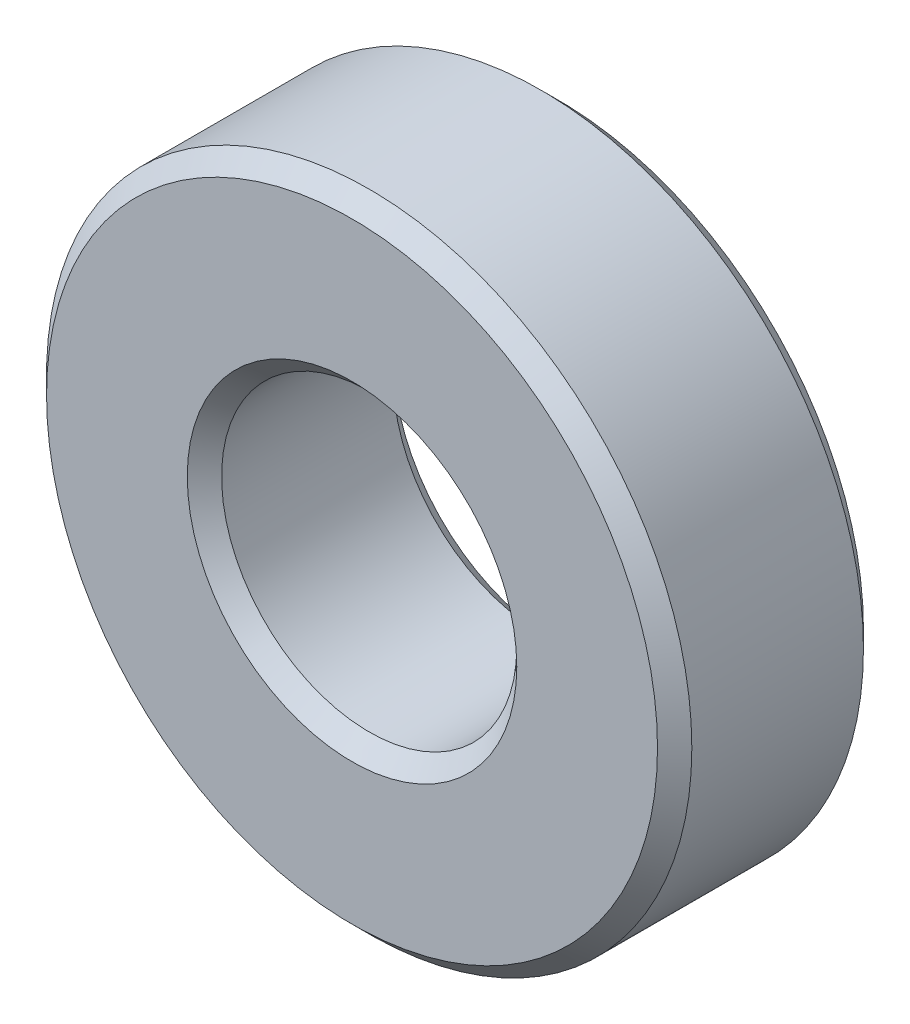
ISO-10303-21;
HEADER;
FILE_DESCRIPTION(('STEP AP214'),'2;1');
FILE_NAME('part.step','',(''),(''),'','','');
FILE_SCHEMA(('AUTOMOTIVE_DESIGN { 1 0 10303 214 1 1 1 1 }'));
ENDSEC;
DATA;
#1=APPLICATION_CONTEXT('core data for automotive mechanical design processes');
#2=APPLICATION_PROTOCOL_DEFINITION('international standard','automotive_design',2000,#1);
#3=PRODUCT_CONTEXT('',#1,'mechanical');
#4=PRODUCT('Part','Part','',(#3));
#5=PRODUCT_RELATED_PRODUCT_CATEGORY('part','',(#4));
#6=PRODUCT_DEFINITION_FORMATION('','',#4);
#7=PRODUCT_DEFINITION_CONTEXT('part definition',#1,'design');
#8=PRODUCT_DEFINITION('design','',#6,#7);
#9=PRODUCT_DEFINITION_SHAPE('','',#8);
#10=(LENGTH_UNIT() NAMED_UNIT(*) SI_UNIT(.MILLI.,.METRE.));
#11=(NAMED_UNIT(*) PLANE_ANGLE_UNIT() SI_UNIT($,.RADIAN.));
#12=(NAMED_UNIT(*) SI_UNIT($,.STERADIAN.) SOLID_ANGLE_UNIT());
#13=UNCERTAINTY_MEASURE_WITH_UNIT(LENGTH_MEASURE(1.E-05),#10,'distance_accuracy_value','');
#14=(GEOMETRIC_REPRESENTATION_CONTEXT(3) GLOBAL_UNCERTAINTY_ASSIGNED_CONTEXT((#13)) GLOBAL_UNIT_ASSIGNED_CONTEXT((#10,
#11,#12)) REPRESENTATION_CONTEXT('',''));
#15=CARTESIAN_POINT('',(0.,0.,0.));
#16=DIRECTION('',(0.,0.,1.));
#17=DIRECTION('',(1.,0.,0.));
#18=AXIS2_PLACEMENT_3D('',#15,#16,#17);
#19=CARTESIAN_POINT('',(0.,0.,6.));
#20=DIRECTION('',(0.,0.,1.));
#21=DIRECTION('',(1.,0.,0.));
#22=AXIS2_PLACEMENT_3D('',#19,#20,#21);
#23=PLANE('',#22);
#24=CARTESIAN_POINT('',(0.,0.,6.));
#25=DIRECTION('',(0.,0.,1.));
#26=DIRECTION('',(1.,0.,0.));
#27=AXIS2_PLACEMENT_3D('',#24,#25,#26);
#28=CIRCLE('',#27,4.80000000000001);
#29=CARTESIAN_POINT('',(4.80000000000001,0.,6.));
#30=VERTEX_POINT('',#29);
#31=EDGE_CURVE('E50',#30,#30,#28,.F.);
#32=ORIENTED_EDGE('',*,*,#31,.T.);
#33=EDGE_LOOP('',(#32));
#34=FACE_BOUND('',#33,.T.);
#35=CARTESIAN_POINT('',(0.,0.,6.));
#36=DIRECTION('',(0.,0.,1.));
#37=DIRECTION('',(1.,0.,0.));
#38=AXIS2_PLACEMENT_3D('',#35,#36,#37);
#39=CIRCLE('',#38,8.9);
#40=CARTESIAN_POINT('',(8.9,0.,6.));
#41=VERTEX_POINT('',#40);
#42=EDGE_CURVE('E53',#41,#41,#39,.T.);
#43=ORIENTED_EDGE('',*,*,#42,.T.);
#44=EDGE_LOOP('',(#43));
#45=FACE_BOUND('',#44,.T.);
#46=ADVANCED_FACE('F30',(#34,#45),#23,.T.);
#47=CARTESIAN_POINT('',(0.,0.,0.));
#48=DIRECTION('',(0.,0.,1.));
#49=DIRECTION('',(1.,0.,0.));
#50=AXIS2_PLACEMENT_3D('',#47,#48,#49);
#51=PLANE('',#50);
#52=CARTESIAN_POINT('',(0.,0.,0.));
#53=DIRECTION('',(0.,0.,1.));
#54=DIRECTION('',(1.,0.,0.));
#55=AXIS2_PLACEMENT_3D('',#52,#53,#54);
#56=CIRCLE('',#55,4.8);
#57=CARTESIAN_POINT('',(4.8,0.,0.));
#58=VERTEX_POINT('',#57);
#59=EDGE_CURVE('E41',#58,#58,#56,.T.);
#60=ORIENTED_EDGE('',*,*,#59,.T.);
#61=EDGE_LOOP('',(#60));
#62=FACE_BOUND('',#61,.T.);
#63=CARTESIAN_POINT('',(0.,0.,0.));
#64=DIRECTION('',(0.,0.,1.));
#65=DIRECTION('',(1.,0.,0.));
#66=AXIS2_PLACEMENT_3D('',#63,#64,#65);
#67=CIRCLE('',#66,8.9);
#68=CARTESIAN_POINT('',(8.9,0.,0.));
#69=VERTEX_POINT('',#68);
#70=EDGE_CURVE('E45',#69,#69,#67,.F.);
#71=ORIENTED_EDGE('',*,*,#70,.T.);
#72=EDGE_LOOP('',(#71));
#73=FACE_BOUND('',#72,.T.);
#74=ADVANCED_FACE('F73',(#62,#73),#51,.F.);
#75=CARTESIAN_POINT('',(0.,0.,6.));
#76=DIRECTION('',(0.,0.,-1.));
#77=DIRECTION('',(-1.,0.,0.));
#78=AXIS2_PLACEMENT_3D('',#75,#76,#77);
#79=CYLINDRICAL_SURFACE('',#78,9.4);
#80=CARTESIAN_POINT('',(0.,0.,0.499999999999999));
#81=DIRECTION('',(0.,0.,1.));
#82=DIRECTION('',(1.,0.,0.));
#83=AXIS2_PLACEMENT_3D('',#80,#81,#82);
#84=CIRCLE('',#83,9.4);
#85=CARTESIAN_POINT('',(9.4,0.,0.499999999999999));
#86=VERTEX_POINT('',#85);
#87=EDGE_CURVE('E10',#86,#86,#84,.T.);
#88=ORIENTED_EDGE('',*,*,#87,.T.);
#89=EDGE_LOOP('',(#88));
#90=FACE_BOUND('',#89,.T.);
#91=CARTESIAN_POINT('',(0.,0.,5.49999999999999));
#92=DIRECTION('',(0.,0.,1.));
#93=DIRECTION('',(1.,0.,0.));
#94=AXIS2_PLACEMENT_3D('',#91,#92,#93);
#95=CIRCLE('',#94,9.4);
#96=CARTESIAN_POINT('',(9.4,0.,5.49999999999999));
#97=VERTEX_POINT('',#96);
#98=EDGE_CURVE('E37',#97,#97,#95,.F.);
#99=ORIENTED_EDGE('',*,*,#98,.T.);
#100=EDGE_LOOP('',(#99));
#101=FACE_BOUND('',#100,.T.);
#102=ADVANCED_FACE('F76',(#90,#101),#79,.T.);
#103=CARTESIAN_POINT('',(0.,0.,6.));
#104=DIRECTION('',(0.,0.,-1.));
#105=DIRECTION('',(-1.,0.,0.));
#106=AXIS2_PLACEMENT_3D('',#103,#104,#105);
#107=CYLINDRICAL_SURFACE('',#106,4.3);
#108=CARTESIAN_POINT('',(0.,0.,5.5));
#109=DIRECTION('',(0.,0.,1.));
#110=DIRECTION('',(1.,0.,0.));
#111=AXIS2_PLACEMENT_3D('',#108,#109,#110);
#112=CIRCLE('',#111,4.3);
#113=CARTESIAN_POINT('',(4.3,0.,5.5));
#114=VERTEX_POINT('',#113);
#115=EDGE_CURVE('E56',#114,#114,#112,.T.);
#116=ORIENTED_EDGE('',*,*,#115,.T.);
#117=EDGE_LOOP('',(#116));
#118=FACE_BOUND('',#117,.T.);
#119=CARTESIAN_POINT('',(0.,0.,0.500000000000004));
#120=DIRECTION('',(0.,0.,1.));
#121=DIRECTION('',(1.,0.,0.));
#122=AXIS2_PLACEMENT_3D('',#119,#120,#121);
#123=CIRCLE('',#122,4.3);
#124=CARTESIAN_POINT('',(4.3,0.,0.500000000000004));
#125=VERTEX_POINT('',#124);
#126=EDGE_CURVE('E59',#125,#125,#123,.F.);
#127=ORIENTED_EDGE('',*,*,#126,.T.);
#128=EDGE_LOOP('',(#127));
#129=FACE_BOUND('',#128,.T.);
#130=ADVANCED_FACE('F63',(#118,#129),#107,.F.);
#131=CARTESIAN_POINT('',(0.,0.,5.5));
#132=DIRECTION('',(0.,0.,1.));
#133=DIRECTION('',(1.,0.,0.));
#134=AXIS2_PLACEMENT_3D('',#131,#132,#133);
#135=CONICAL_SURFACE('',#134,4.3,0.78539816339745);
#136=ORIENTED_EDGE('',*,*,#31,.F.);
#137=EDGE_LOOP('',(#136));
#138=FACE_BOUND('',#137,.T.);
#139=ORIENTED_EDGE('',*,*,#115,.F.);
#140=EDGE_LOOP('',(#139));
#141=FACE_BOUND('',#140,.T.);
#142=ADVANCED_FACE('F69',(#138,#141),#135,.F.);
#143=CARTESIAN_POINT('',(0.,0.,0.));
#144=DIRECTION('',(0.,0.,-1.));
#145=DIRECTION('',(-1.,0.,0.));
#146=AXIS2_PLACEMENT_3D('',#143,#144,#145);
#147=CONICAL_SURFACE('',#146,4.8,0.785398163397448);
#148=ORIENTED_EDGE('',*,*,#126,.F.);
#149=EDGE_LOOP('',(#148));
#150=FACE_BOUND('',#149,.T.);
#151=ORIENTED_EDGE('',*,*,#59,.F.);
#152=EDGE_LOOP('',(#151));
#153=FACE_BOUND('',#152,.T.);
#154=ADVANCED_FACE('F65',(#150,#153),#147,.F.);
#155=CARTESIAN_POINT('',(0.,0.,0.499999999999999));
#156=DIRECTION('',(0.,0.,1.));
#157=DIRECTION('',(1.,0.,0.));
#158=AXIS2_PLACEMENT_3D('',#155,#156,#157);
#159=CONICAL_SURFACE('',#158,9.4,0.785398163397452);
#160=ORIENTED_EDGE('',*,*,#70,.F.);
#161=EDGE_LOOP('',(#160));
#162=FACE_BOUND('',#161,.T.);
#163=ORIENTED_EDGE('',*,*,#87,.F.);
#164=EDGE_LOOP('',(#163));
#165=FACE_BOUND('',#164,.T.);
#166=ADVANCED_FACE('F68',(#162,#165),#159,.T.);
#167=CARTESIAN_POINT('',(0.,0.,6.));
#168=DIRECTION('',(0.,0.,-1.));
#169=DIRECTION('',(-1.,0.,0.));
#170=AXIS2_PLACEMENT_3D('',#167,#168,#169);
#171=CONICAL_SURFACE('',#170,8.9,0.785398163397443);
#172=ORIENTED_EDGE('',*,*,#98,.F.);
#173=EDGE_LOOP('',(#172));
#174=FACE_BOUND('',#173,.T.);
#175=ORIENTED_EDGE('',*,*,#42,.F.);
#176=EDGE_LOOP('',(#175));
#177=FACE_BOUND('',#176,.T.);
#178=ADVANCED_FACE('F32',(#174,#177),#171,.T.);
#179=CLOSED_SHELL('',(#46,#74,#102,#130,#142,#154,#166,#178));
#180=MANIFOLD_SOLID_BREP('B2',#179);
#181=ADVANCED_BREP_SHAPE_REPRESENTATION('',(#18,#180),#14);
#182=SHAPE_DEFINITION_REPRESENTATION(#9,#181);
ENDSEC;
END-ISO-10303-21;
